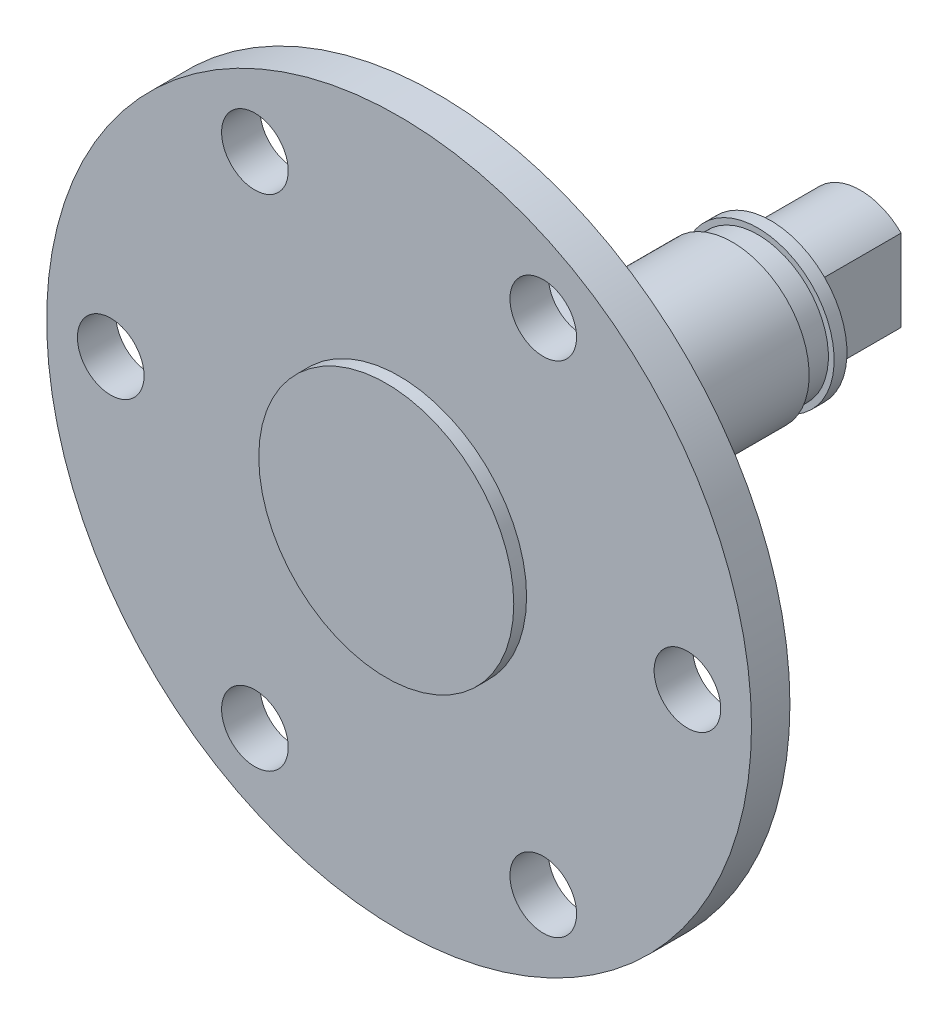
ISO-10303-21;
HEADER;
FILE_DESCRIPTION(('STEP AP214'),'2;1');
FILE_NAME('part.step','',(''),(''),'','','');
FILE_SCHEMA(('AUTOMOTIVE_DESIGN { 1 0 10303 214 1 1 1 1 }'));
ENDSEC;
DATA;
#1=APPLICATION_CONTEXT('core data for automotive mechanical design processes');
#2=APPLICATION_PROTOCOL_DEFINITION('international standard','automotive_design',2000,#1);
#3=PRODUCT_CONTEXT('',#1,'mechanical');
#4=PRODUCT('Part','Part','',(#3));
#5=PRODUCT_RELATED_PRODUCT_CATEGORY('part','',(#4));
#6=PRODUCT_DEFINITION_FORMATION('','',#4);
#7=PRODUCT_DEFINITION_CONTEXT('part definition',#1,'design');
#8=PRODUCT_DEFINITION('design','',#6,#7);
#9=PRODUCT_DEFINITION_SHAPE('','',#8);
#10=(LENGTH_UNIT() NAMED_UNIT(*) SI_UNIT(.MILLI.,.METRE.));
#11=(NAMED_UNIT(*) PLANE_ANGLE_UNIT() SI_UNIT($,.RADIAN.));
#12=(NAMED_UNIT(*) SI_UNIT($,.STERADIAN.) SOLID_ANGLE_UNIT());
#13=UNCERTAINTY_MEASURE_WITH_UNIT(LENGTH_MEASURE(1.E-05),#10,'distance_accuracy_value','');
#14=(GEOMETRIC_REPRESENTATION_CONTEXT(3) GLOBAL_UNCERTAINTY_ASSIGNED_CONTEXT((#13)) GLOBAL_UNIT_ASSIGNED_CONTEXT((#10,
#11,#12)) REPRESENTATION_CONTEXT('',''));
#15=CARTESIAN_POINT('',(0.,0.,0.));
#16=DIRECTION('',(0.,0.,1.));
#17=DIRECTION('',(1.,0.,0.));
#18=AXIS2_PLACEMENT_3D('',#15,#16,#17);
#19=CARTESIAN_POINT('',(0.,0.,-26.));
#20=DIRECTION('',(0.,0.,-1.));
#21=DIRECTION('',(-1.,0.,0.));
#22=AXIS2_PLACEMENT_3D('',#19,#20,#21);
#23=PLANE('',#22);
#24=CARTESIAN_POINT('',(0.,0.,-26.));
#25=DIRECTION('',(0.,0.,-1.));
#26=DIRECTION('',(-1.,0.,0.));
#27=AXIS2_PLACEMENT_3D('',#24,#25,#26);
#28=CIRCLE('',#27,5.95);
#29=CARTESIAN_POINT('',(-5.95,0.,-26.));
#30=VERTEX_POINT('',#29);
#31=EDGE_CURVE('E115',#30,#30,#28,.T.);
#32=ORIENTED_EDGE('',*,*,#31,.T.);
#33=EDGE_LOOP('',(#32));
#34=FACE_BOUND('',#33,.T.);
#35=DIRECTION('',(0.,1.,0.));
#36=VECTOR('',#35,1.);
#37=CARTESIAN_POINT('',(3.175,0.,-26.));
#38=LINE('',#37,#36);
#39=CARTESIAN_POINT('',(3.175,-3.1889457505577,-26.));
#40=VERTEX_POINT('',#39);
#41=CARTESIAN_POINT('',(3.175,3.1889457505577,-26.));
#42=VERTEX_POINT('',#41);
#43=EDGE_CURVE('E103',#40,#42,#38,.T.);
#44=ORIENTED_EDGE('',*,*,#43,.T.);
#45=CARTESIAN_POINT('',(0.,0.,-26.));
#46=DIRECTION('',(0.,0.,-1.));
#47=DIRECTION('',(-1.,0.,0.));
#48=AXIS2_PLACEMENT_3D('',#45,#46,#47);
#49=CIRCLE('',#48,4.5);
#50=CARTESIAN_POINT('',(-3.175,3.1889457505577,-26.));
#51=VERTEX_POINT('',#50);
#52=EDGE_CURVE('E109',#51,#42,#49,.T.);
#53=ORIENTED_EDGE('',*,*,#52,.F.);
#54=DIRECTION('',(0.,1.,0.));
#55=VECTOR('',#54,1.);
#56=CARTESIAN_POINT('',(-3.175,0.,-26.));
#57=LINE('',#56,#55);
#58=CARTESIAN_POINT('',(-3.175,-3.1889457505577,-26.));
#59=VERTEX_POINT('',#58);
#60=EDGE_CURVE('E107',#59,#51,#57,.T.);
#61=ORIENTED_EDGE('',*,*,#60,.F.);
#62=CARTESIAN_POINT('',(0.,0.,-26.));
#63=DIRECTION('',(0.,0.,-1.));
#64=DIRECTION('',(-1.,0.,0.));
#65=AXIS2_PLACEMENT_3D('',#62,#63,#64);
#66=CIRCLE('',#65,4.5);
#67=EDGE_CURVE('E94',#40,#59,#66,.T.);
#68=ORIENTED_EDGE('',*,*,#67,.F.);
#69=EDGE_LOOP('',(#44,#53,#61,#68));
#70=FACE_BOUND('',#69,.T.);
#71=ADVANCED_FACE('F36',(#34,#70),#23,.T.);
#72=CARTESIAN_POINT('',(0.,0.,3.));
#73=DIRECTION('',(0.,0.,-1.));
#74=DIRECTION('',(-1.,0.,0.));
#75=AXIS2_PLACEMENT_3D('',#72,#73,#74);
#76=CYLINDRICAL_SURFACE('',#75,27.5);
#77=CARTESIAN_POINT('',(0.,0.,3.));
#78=DIRECTION('',(0.,0.,1.));
#79=DIRECTION('',(1.,0.,0.));
#80=AXIS2_PLACEMENT_3D('',#77,#78,#79);
#81=CIRCLE('',#80,27.5);
#82=CARTESIAN_POINT('',(27.5,0.,3.));
#83=VERTEX_POINT('',#82);
#84=EDGE_CURVE('E162',#83,#83,#81,.T.);
#85=ORIENTED_EDGE('',*,*,#84,.F.);
#86=EDGE_LOOP('',(#85));
#87=FACE_BOUND('',#86,.T.);
#88=CARTESIAN_POINT('',(0.,0.,0.));
#89=DIRECTION('',(0.,0.,1.));
#90=DIRECTION('',(1.,0.,0.));
#91=AXIS2_PLACEMENT_3D('',#88,#89,#90);
#92=CIRCLE('',#91,27.5);
#93=CARTESIAN_POINT('',(27.5,0.,0.));
#94=VERTEX_POINT('',#93);
#95=EDGE_CURVE('E165',#94,#94,#92,.T.);
#96=ORIENTED_EDGE('',*,*,#95,.T.);
#97=EDGE_LOOP('',(#96));
#98=FACE_BOUND('',#97,.T.);
#99=ADVANCED_FACE('F202',(#87,#98),#76,.T.);
#100=CARTESIAN_POINT('',(0.,0.,3.));
#101=DIRECTION('',(0.,0.,1.));
#102=DIRECTION('',(1.,0.,0.));
#103=AXIS2_PLACEMENT_3D('',#100,#101,#102);
#104=PLANE('',#103);
#105=CARTESIAN_POINT('',(0.,0.,3.));
#106=DIRECTION('',(0.,0.,1.));
#107=DIRECTION('',(1.,0.,0.));
#108=AXIS2_PLACEMENT_3D('',#105,#106,#107);
#109=CIRCLE('',#108,9.95);
#110=CARTESIAN_POINT('',(9.95,0.,3.));
#111=VERTEX_POINT('',#110);
#112=EDGE_CURVE('E135',#111,#111,#109,.T.);
#113=ORIENTED_EDGE('',*,*,#112,.F.);
#114=EDGE_LOOP('',(#113));
#115=FACE_BOUND('',#114,.T.);
#116=CARTESIAN_POINT('',(11.25,-19.4855715851499,3.));
#117=DIRECTION('',(0.,0.,1.));
#118=DIRECTION('',(1.,0.,0.));
#119=AXIS2_PLACEMENT_3D('',#116,#117,#118);
#120=CIRCLE('',#119,2.6);
#121=CARTESIAN_POINT('',(13.85,-19.4855715851499,3.));
#122=VERTEX_POINT('',#121);
#123=EDGE_CURVE('E142',#122,#122,#120,.T.);
#124=ORIENTED_EDGE('',*,*,#123,.F.);
#125=EDGE_LOOP('',(#124));
#126=FACE_BOUND('',#125,.T.);
#127=CARTESIAN_POINT('',(-11.25,-19.4855715851499,3.));
#128=DIRECTION('',(0.,0.,1.));
#129=DIRECTION('',(1.,0.,0.));
#130=AXIS2_PLACEMENT_3D('',#127,#128,#129);
#131=CIRCLE('',#130,2.6);
#132=CARTESIAN_POINT('',(-8.65,-19.4855715851499,3.));
#133=VERTEX_POINT('',#132);
#134=EDGE_CURVE('E146',#133,#133,#131,.T.);
#135=ORIENTED_EDGE('',*,*,#134,.F.);
#136=EDGE_LOOP('',(#135));
#137=FACE_BOUND('',#136,.T.);
#138=CARTESIAN_POINT('',(-22.5,0.,3.));
#139=DIRECTION('',(0.,0.,1.));
#140=DIRECTION('',(1.,0.,0.));
#141=AXIS2_PLACEMENT_3D('',#138,#139,#140);
#142=CIRCLE('',#141,2.6);
#143=CARTESIAN_POINT('',(-19.9,0.,3.));
#144=VERTEX_POINT('',#143);
#145=EDGE_CURVE('E149',#144,#144,#142,.T.);
#146=ORIENTED_EDGE('',*,*,#145,.F.);
#147=EDGE_LOOP('',(#146));
#148=FACE_BOUND('',#147,.T.);
#149=CARTESIAN_POINT('',(-11.25,19.4855715851499,3.));
#150=DIRECTION('',(0.,0.,1.));
#151=DIRECTION('',(1.,0.,0.));
#152=AXIS2_PLACEMENT_3D('',#149,#150,#151);
#153=CIRCLE('',#152,2.6);
#154=CARTESIAN_POINT('',(-8.65000000000001,19.4855715851499,3.));
#155=VERTEX_POINT('',#154);
#156=EDGE_CURVE('E152',#155,#155,#153,.T.);
#157=ORIENTED_EDGE('',*,*,#156,.F.);
#158=EDGE_LOOP('',(#157));
#159=FACE_BOUND('',#158,.T.);
#160=CARTESIAN_POINT('',(11.25,19.4855715851499,3.));
#161=DIRECTION('',(0.,0.,1.));
#162=DIRECTION('',(1.,0.,0.));
#163=AXIS2_PLACEMENT_3D('',#160,#161,#162);
#164=CIRCLE('',#163,2.6);
#165=CARTESIAN_POINT('',(13.85,19.4855715851499,3.));
#166=VERTEX_POINT('',#165);
#167=EDGE_CURVE('E139',#166,#166,#164,.T.);
#168=ORIENTED_EDGE('',*,*,#167,.F.);
#169=EDGE_LOOP('',(#168));
#170=FACE_BOUND('',#169,.T.);
#171=CARTESIAN_POINT('',(22.5,0.,3.));
#172=DIRECTION('',(0.,0.,1.));
#173=DIRECTION('',(1.,0.,0.));
#174=AXIS2_PLACEMENT_3D('',#171,#172,#173);
#175=CIRCLE('',#174,2.59999999999999);
#176=CARTESIAN_POINT('',(25.1,0.,3.));
#177=VERTEX_POINT('',#176);
#178=EDGE_CURVE('E157',#177,#177,#175,.T.);
#179=ORIENTED_EDGE('',*,*,#178,.F.);
#180=EDGE_LOOP('',(#179));
#181=FACE_BOUND('',#180,.T.);
#182=ORIENTED_EDGE('',*,*,#84,.T.);
#183=EDGE_LOOP('',(#182));
#184=FACE_BOUND('',#183,.T.);
#185=ADVANCED_FACE('F208',(#115,#126,#137,#148,#159,#170,#181,#184),#104,.T.);
#186=CARTESIAN_POINT('',(0.,0.,0.));
#187=DIRECTION('',(0.,0.,1.));
#188=DIRECTION('',(1.,0.,0.));
#189=AXIS2_PLACEMENT_3D('',#186,#187,#188);
#190=PLANE('',#189);
#191=CARTESIAN_POINT('',(0.,0.,0.));
#192=DIRECTION('',(0.,0.,1.));
#193=DIRECTION('',(1.,0.,0.));
#194=AXIS2_PLACEMENT_3D('',#191,#192,#193);
#195=CIRCLE('',#194,13.);
#196=CARTESIAN_POINT('',(13.,0.,0.));
#197=VERTEX_POINT('',#196);
#198=EDGE_CURVE('E11',#197,#197,#195,.T.);
#199=ORIENTED_EDGE('',*,*,#198,.T.);
#200=EDGE_LOOP('',(#199));
#201=FACE_BOUND('',#200,.T.);
#202=CARTESIAN_POINT('',(11.25,-19.4855715851499,0.));
#203=DIRECTION('',(0.,0.,1.));
#204=DIRECTION('',(1.,0.,0.));
#205=AXIS2_PLACEMENT_3D('',#202,#203,#204);
#206=CIRCLE('',#205,2.6);
#207=CARTESIAN_POINT('',(13.85,-19.4855715851499,0.));
#208=VERTEX_POINT('',#207);
#209=EDGE_CURVE('E161',#208,#208,#206,.T.);
#210=ORIENTED_EDGE('',*,*,#209,.T.);
#211=EDGE_LOOP('',(#210));
#212=FACE_BOUND('',#211,.T.);
#213=CARTESIAN_POINT('',(-11.25,-19.4855715851499,0.));
#214=DIRECTION('',(0.,0.,1.));
#215=DIRECTION('',(1.,0.,0.));
#216=AXIS2_PLACEMENT_3D('',#213,#214,#215);
#217=CIRCLE('',#216,2.6);
#218=CARTESIAN_POINT('',(-8.65,-19.4855715851499,0.));
#219=VERTEX_POINT('',#218);
#220=EDGE_CURVE('E178',#219,#219,#217,.T.);
#221=ORIENTED_EDGE('',*,*,#220,.T.);
#222=EDGE_LOOP('',(#221));
#223=FACE_BOUND('',#222,.T.);
#224=CARTESIAN_POINT('',(-22.5,0.,0.));
#225=DIRECTION('',(0.,0.,1.));
#226=DIRECTION('',(1.,0.,0.));
#227=AXIS2_PLACEMENT_3D('',#224,#225,#226);
#228=CIRCLE('',#227,2.6);
#229=CARTESIAN_POINT('',(-19.9,0.,0.));
#230=VERTEX_POINT('',#229);
#231=EDGE_CURVE('E175',#230,#230,#228,.T.);
#232=ORIENTED_EDGE('',*,*,#231,.T.);
#233=EDGE_LOOP('',(#232));
#234=FACE_BOUND('',#233,.T.);
#235=CARTESIAN_POINT('',(-11.25,19.4855715851499,0.));
#236=DIRECTION('',(0.,0.,1.));
#237=DIRECTION('',(1.,0.,0.));
#238=AXIS2_PLACEMENT_3D('',#235,#236,#237);
#239=CIRCLE('',#238,2.6);
#240=CARTESIAN_POINT('',(-8.65000000000001,19.4855715851499,0.));
#241=VERTEX_POINT('',#240);
#242=EDGE_CURVE('E172',#241,#241,#239,.T.);
#243=ORIENTED_EDGE('',*,*,#242,.T.);
#244=EDGE_LOOP('',(#243));
#245=FACE_BOUND('',#244,.T.);
#246=CARTESIAN_POINT('',(11.25,19.4855715851499,0.));
#247=DIRECTION('',(0.,0.,1.));
#248=DIRECTION('',(1.,0.,0.));
#249=AXIS2_PLACEMENT_3D('',#246,#247,#248);
#250=CIRCLE('',#249,2.6);
#251=CARTESIAN_POINT('',(13.85,19.4855715851499,0.));
#252=VERTEX_POINT('',#251);
#253=EDGE_CURVE('E145',#252,#252,#250,.T.);
#254=ORIENTED_EDGE('',*,*,#253,.T.);
#255=EDGE_LOOP('',(#254));
#256=FACE_BOUND('',#255,.T.);
#257=CARTESIAN_POINT('',(22.5,0.,0.));
#258=DIRECTION('',(0.,0.,1.));
#259=DIRECTION('',(1.,0.,0.));
#260=AXIS2_PLACEMENT_3D('',#257,#258,#259);
#261=CIRCLE('',#260,2.59999999999999);
#262=CARTESIAN_POINT('',(25.1,0.,0.));
#263=VERTEX_POINT('',#262);
#264=EDGE_CURVE('E160',#263,#263,#261,.T.);
#265=ORIENTED_EDGE('',*,*,#264,.T.);
#266=EDGE_LOOP('',(#265));
#267=FACE_BOUND('',#266,.T.);
#268=ORIENTED_EDGE('',*,*,#95,.F.);
#269=EDGE_LOOP('',(#268));
#270=FACE_BOUND('',#269,.T.);
#271=ADVANCED_FACE('F265',(#201,#212,#223,#234,#245,#256,#267,#270),#190,.F.);
#272=CARTESIAN_POINT('',(22.5,0.,-2.));
#273=DIRECTION('',(0.,0.,1.));
#274=DIRECTION('',(1.,0.,0.));
#275=AXIS2_PLACEMENT_3D('',#272,#273,#274);
#276=CYLINDRICAL_SURFACE('',#275,2.59999999999999);
#277=ORIENTED_EDGE('',*,*,#178,.T.);
#278=EDGE_LOOP('',(#277));
#279=FACE_BOUND('',#278,.T.);
#280=ORIENTED_EDGE('',*,*,#264,.F.);
#281=EDGE_LOOP('',(#280));
#282=FACE_BOUND('',#281,.T.);
#283=ADVANCED_FACE('F261',(#279,#282),#276,.F.);
#284=CARTESIAN_POINT('',(11.25,19.4855715851499,-2.));
#285=DIRECTION('',(0.,0.,1.));
#286=DIRECTION('',(1.,0.,0.));
#287=AXIS2_PLACEMENT_3D('',#284,#285,#286);
#288=CYLINDRICAL_SURFACE('',#287,2.6);
#289=ORIENTED_EDGE('',*,*,#167,.T.);
#290=EDGE_LOOP('',(#289));
#291=FACE_BOUND('',#290,.T.);
#292=ORIENTED_EDGE('',*,*,#253,.F.);
#293=EDGE_LOOP('',(#292));
#294=FACE_BOUND('',#293,.T.);
#295=ADVANCED_FACE('F257',(#291,#294),#288,.F.);
#296=CARTESIAN_POINT('',(-11.25,19.4855715851499,-2.));
#297=DIRECTION('',(0.,0.,1.));
#298=DIRECTION('',(1.,0.,0.));
#299=AXIS2_PLACEMENT_3D('',#296,#297,#298);
#300=CYLINDRICAL_SURFACE('',#299,2.6);
#301=ORIENTED_EDGE('',*,*,#156,.T.);
#302=EDGE_LOOP('',(#301));
#303=FACE_BOUND('',#302,.T.);
#304=ORIENTED_EDGE('',*,*,#242,.F.);
#305=EDGE_LOOP('',(#304));
#306=FACE_BOUND('',#305,.T.);
#307=ADVANCED_FACE('F253',(#303,#306),#300,.F.);
#308=CARTESIAN_POINT('',(-22.5,0.,-2.));
#309=DIRECTION('',(0.,0.,1.));
#310=DIRECTION('',(1.,0.,0.));
#311=AXIS2_PLACEMENT_3D('',#308,#309,#310);
#312=CYLINDRICAL_SURFACE('',#311,2.6);
#313=ORIENTED_EDGE('',*,*,#145,.T.);
#314=EDGE_LOOP('',(#313));
#315=FACE_BOUND('',#314,.T.);
#316=ORIENTED_EDGE('',*,*,#231,.F.);
#317=EDGE_LOOP('',(#316));
#318=FACE_BOUND('',#317,.T.);
#319=ADVANCED_FACE('F249',(#315,#318),#312,.F.);
#320=CARTESIAN_POINT('',(-11.25,-19.4855715851499,-2.));
#321=DIRECTION('',(0.,0.,1.));
#322=DIRECTION('',(1.,0.,0.));
#323=AXIS2_PLACEMENT_3D('',#320,#321,#322);
#324=CYLINDRICAL_SURFACE('',#323,2.6);
#325=ORIENTED_EDGE('',*,*,#134,.T.);
#326=EDGE_LOOP('',(#325));
#327=FACE_BOUND('',#326,.T.);
#328=ORIENTED_EDGE('',*,*,#220,.F.);
#329=EDGE_LOOP('',(#328));
#330=FACE_BOUND('',#329,.T.);
#331=ADVANCED_FACE('F245',(#327,#330),#324,.F.);
#332=CARTESIAN_POINT('',(11.25,-19.4855715851499,-2.));
#333=DIRECTION('',(0.,0.,1.));
#334=DIRECTION('',(1.,0.,0.));
#335=AXIS2_PLACEMENT_3D('',#332,#333,#334);
#336=CYLINDRICAL_SURFACE('',#335,2.6);
#337=ORIENTED_EDGE('',*,*,#123,.T.);
#338=EDGE_LOOP('',(#337));
#339=FACE_BOUND('',#338,.T.);
#340=ORIENTED_EDGE('',*,*,#209,.F.);
#341=EDGE_LOOP('',(#340));
#342=FACE_BOUND('',#341,.T.);
#343=ADVANCED_FACE('F241',(#339,#342),#336,.F.);
#344=CARTESIAN_POINT('',(0.,0.,4.));
#345=DIRECTION('',(0.,0.,-1.));
#346=DIRECTION('',(-1.,0.,0.));
#347=AXIS2_PLACEMENT_3D('',#344,#345,#346);
#348=CYLINDRICAL_SURFACE('',#347,9.95);
#349=CARTESIAN_POINT('',(0.,0.,4.));
#350=DIRECTION('',(0.,0.,1.));
#351=DIRECTION('',(1.,0.,0.));
#352=AXIS2_PLACEMENT_3D('',#349,#350,#351);
#353=CIRCLE('',#352,9.95);
#354=CARTESIAN_POINT('',(9.95,0.,4.));
#355=VERTEX_POINT('',#354);
#356=EDGE_CURVE('E136',#355,#355,#353,.T.);
#357=ORIENTED_EDGE('',*,*,#356,.F.);
#358=EDGE_LOOP('',(#357));
#359=FACE_BOUND('',#358,.T.);
#360=ORIENTED_EDGE('',*,*,#112,.T.);
#361=EDGE_LOOP('',(#360));
#362=FACE_BOUND('',#361,.T.);
#363=ADVANCED_FACE('F237',(#359,#362),#348,.T.);
#364=CARTESIAN_POINT('',(0.,0.,4.));
#365=DIRECTION('',(0.,0.,1.));
#366=DIRECTION('',(1.,0.,0.));
#367=AXIS2_PLACEMENT_3D('',#364,#365,#366);
#368=PLANE('',#367);
#369=ORIENTED_EDGE('',*,*,#356,.T.);
#370=EDGE_LOOP('',(#369));
#371=FACE_BOUND('',#370,.T.);
#372=ADVANCED_FACE('F234',(#371),#368,.T.);
#373=CARTESIAN_POINT('',(0.,0.,-13.));
#374=DIRECTION('',(0.,0.,1.));
#375=DIRECTION('',(1.,0.,0.));
#376=AXIS2_PLACEMENT_3D('',#373,#374,#375);
#377=CYLINDRICAL_SURFACE('',#376,8.);
#378=CARTESIAN_POINT('',(0.,0.,-5.));
#379=DIRECTION('',(0.,0.,1.));
#380=DIRECTION('',(1.,0.,0.));
#381=AXIS2_PLACEMENT_3D('',#378,#379,#380);
#382=CIRCLE('',#381,8.);
#383=CARTESIAN_POINT('',(8.,0.,-5.));
#384=VERTEX_POINT('',#383);
#385=EDGE_CURVE('E44',#384,#384,#382,.F.);
#386=CARTESIAN_POINT('',(0.,0.,-13.));
#387=DIRECTION('',(0.,0.,-1.));
#388=DIRECTION('',(-1.,0.,0.));
#389=AXIS2_PLACEMENT_3D('',#386,#387,#388);
#390=CIRCLE('',#389,8.);
#391=CARTESIAN_POINT('',(8.,0.,-13.));
#392=VERTEX_POINT('',#391);
#393=EDGE_CURVE('E130',#392,#392,#390,.T.);
#394=CARTESIAN_POINT('',(8.,0.,-5.));
#395=CARTESIAN_POINT('',(8.,0.,-5.08333333333333));
#396=CARTESIAN_POINT('',(8.,0.,-5.16666666666667));
#397=CARTESIAN_POINT('',(8.,0.,-5.33333333333333));
#398=CARTESIAN_POINT('',(8.,0.,-5.41666666666667));
#399=CARTESIAN_POINT('',(8.,0.,-5.58333333333333));
#400=CARTESIAN_POINT('',(8.,0.,-5.66666666666667));
#401=CARTESIAN_POINT('',(8.,0.,-5.83333333333333));
#402=CARTESIAN_POINT('',(8.,0.,-5.91666666666667));
#403=CARTESIAN_POINT('',(8.,0.,-6.08333333333333));
#404=CARTESIAN_POINT('',(8.,0.,-6.16666666666667));
#405=CARTESIAN_POINT('',(8.,0.,-6.33333333333333));
#406=CARTESIAN_POINT('',(8.,0.,-6.41666666666667));
#407=CARTESIAN_POINT('',(8.,0.,-6.58333333333333));
#408=CARTESIAN_POINT('',(8.,0.,-6.66666666666667));
#409=CARTESIAN_POINT('',(8.,0.,-6.83333333333333));
#410=CARTESIAN_POINT('',(8.,0.,-6.91666666666667));
#411=CARTESIAN_POINT('',(8.,0.,-7.08333333333333));
#412=CARTESIAN_POINT('',(8.,0.,-7.16666666666667));
#413=CARTESIAN_POINT('',(8.,0.,-7.33333333333333));
#414=CARTESIAN_POINT('',(8.,0.,-7.41666666666667));
#415=CARTESIAN_POINT('',(8.,0.,-7.58333333333333));
#416=CARTESIAN_POINT('',(8.,0.,-7.66666666666667));
#417=CARTESIAN_POINT('',(8.,0.,-7.83333333333333));
#418=CARTESIAN_POINT('',(8.,0.,-7.91666666666667));
#419=CARTESIAN_POINT('',(8.,0.,-8.08333333333333));
#420=CARTESIAN_POINT('',(8.,0.,-8.16666666666667));
#421=CARTESIAN_POINT('',(8.,0.,-8.33333333333333));
#422=CARTESIAN_POINT('',(8.,0.,-8.41666666666667));
#423=CARTESIAN_POINT('',(8.,0.,-8.58333333333333));
#424=CARTESIAN_POINT('',(8.,0.,-8.66666666666667));
#425=CARTESIAN_POINT('',(8.,0.,-8.83333333333333));
#426=CARTESIAN_POINT('',(8.,0.,-8.91666666666667));
#427=CARTESIAN_POINT('',(8.,0.,-9.08333333333333));
#428=CARTESIAN_POINT('',(8.,0.,-9.16666666666667));
#429=CARTESIAN_POINT('',(8.,0.,-9.33333333333333));
#430=CARTESIAN_POINT('',(8.,0.,-9.41666666666667));
#431=CARTESIAN_POINT('',(8.,0.,-9.58333333333333));
#432=CARTESIAN_POINT('',(8.,0.,-9.66666666666667));
#433=CARTESIAN_POINT('',(8.,0.,-9.83333333333333));
#434=CARTESIAN_POINT('',(8.,0.,-9.91666666666667));
#435=CARTESIAN_POINT('',(8.,0.,-10.0833333333333));
#436=CARTESIAN_POINT('',(8.,0.,-10.1666666666667));
#437=CARTESIAN_POINT('',(8.,0.,-10.3333333333333));
#438=CARTESIAN_POINT('',(8.,0.,-10.4166666666667));
#439=CARTESIAN_POINT('',(8.,0.,-10.5833333333333));
#440=CARTESIAN_POINT('',(8.,0.,-10.6666666666667));
#441=CARTESIAN_POINT('',(8.,0.,-10.8333333333333));
#442=CARTESIAN_POINT('',(8.,0.,-10.9166666666667));
#443=CARTESIAN_POINT('',(8.,0.,-11.0833333333333));
#444=CARTESIAN_POINT('',(8.,0.,-11.1666666666667));
#445=CARTESIAN_POINT('',(8.,0.,-11.3333333333333));
#446=CARTESIAN_POINT('',(8.,0.,-11.4166666666667));
#447=CARTESIAN_POINT('',(8.,0.,-11.5833333333333));
#448=CARTESIAN_POINT('',(8.,0.,-11.6666666666667));
#449=CARTESIAN_POINT('',(8.,0.,-11.8333333333333));
#450=CARTESIAN_POINT('',(8.,0.,-11.9166666666667));
#451=CARTESIAN_POINT('',(8.,0.,-12.0833333333333));
#452=CARTESIAN_POINT('',(8.,0.,-12.1666666666667));
#453=CARTESIAN_POINT('',(8.,0.,-12.3333333333333));
#454=CARTESIAN_POINT('',(8.,0.,-12.4166666666667));
#455=CARTESIAN_POINT('',(8.,0.,-12.5833333333333));
#456=CARTESIAN_POINT('',(8.,0.,-12.6666666666667));
#457=CARTESIAN_POINT('',(8.,0.,-12.8333333333333));
#458=CARTESIAN_POINT('',(8.,0.,-12.9166666666667));
#459=CARTESIAN_POINT('',(8.,0.,-13.));
#460=B_SPLINE_CURVE_WITH_KNOTS('',3,(#394,#395,#396,#397,#398,#399,#400,#401,#402,#403,#404,
#405,#406,#407,#408,#409,#410,#411,#412,#413,#414,#415,#416,#417,#418,#419,#420,#421,#422,#423,
#424,#425,#426,#427,#428,#429,#430,#431,#432,#433,#434,#435,#436,#437,#438,#439,#440,#441,#442,
#443,#444,#445,#446,#447,#448,#449,#450,#451,#452,#453,#454,#455,#456,#457,#458,#459),
.UNSPECIFIED.,.F.,.F.,(4,2,2,2,2,2,2,2,2,2,2,2,2,2,2,2,2,2,2,2,2,2,2,2,2,2,2,2,2,2,2,2,4),(0.,
0.249999999999999,0.5,0.749999999999999,0.999999999999999,1.25,1.5,1.75,2.,2.25,2.5,2.75,3.,
3.25,3.5,3.75,4.,4.25,4.5,4.75,5.,5.25,5.5,5.75,6.,6.25,6.5,6.75,7.,7.25,7.5,7.75,8.),.UNSPECIFIED.);
#461=EDGE_CURVE('BSEAM185',#384,#392,#460,.T.);
#462=ORIENTED_EDGE('',*,*,#385,.T.);
#463=ORIENTED_EDGE('',*,*,#393,.F.);
#464=ORIENTED_EDGE('',*,*,#461,.T.);
#465=ORIENTED_EDGE('',*,*,#461,.F.);
#466=EDGE_LOOP('',(#462,#464,#463,#465));
#467=FACE_BOUND('',#466,.T.);
#468=ADVANCED_FACE('F185',(#467),#377,.T.);
#469=CARTESIAN_POINT('',(0.,0.,-13.));
#470=DIRECTION('',(0.,0.,-1.));
#471=DIRECTION('',(-1.,0.,0.));
#472=AXIS2_PLACEMENT_3D('',#469,#470,#471);
#473=PLANE('',#472);
#474=CARTESIAN_POINT('',(0.,0.,-13.));
#475=DIRECTION('',(0.,0.,-1.));
#476=DIRECTION('',(-1.,0.,0.));
#477=AXIS2_PLACEMENT_3D('',#474,#475,#476);
#478=CIRCLE('',#477,6.);
#479=CARTESIAN_POINT('',(-6.,0.,-13.));
#480=VERTEX_POINT('',#479);
#481=EDGE_CURVE('E124',#480,#480,#478,.T.);
#482=ORIENTED_EDGE('',*,*,#481,.F.);
#483=EDGE_LOOP('',(#482));
#484=FACE_BOUND('',#483,.T.);
#485=ORIENTED_EDGE('',*,*,#393,.T.);
#486=EDGE_LOOP('',(#485));
#487=FACE_BOUND('',#486,.T.);
#488=ADVANCED_FACE('F227',(#484,#487),#473,.T.);
#489=CARTESIAN_POINT('',(0.,0.,-23.));
#490=DIRECTION('',(0.,0.,1.));
#491=DIRECTION('',(1.,0.,0.));
#492=AXIS2_PLACEMENT_3D('',#489,#490,#491);
#493=CYLINDRICAL_SURFACE('',#492,6.);
#494=CARTESIAN_POINT('',(0.,0.,-23.));
#495=DIRECTION('',(0.,0.,-1.));
#496=DIRECTION('',(-1.,0.,0.));
#497=AXIS2_PLACEMENT_3D('',#494,#495,#496);
#498=CIRCLE('',#497,6.);
#499=CARTESIAN_POINT('',(-6.,0.,-23.));
#500=VERTEX_POINT('',#499);
#501=EDGE_CURVE('E127',#500,#500,#498,.T.);
#502=ORIENTED_EDGE('',*,*,#501,.F.);
#503=EDGE_LOOP('',(#502));
#504=FACE_BOUND('',#503,.T.);
#505=ORIENTED_EDGE('',*,*,#481,.T.);
#506=EDGE_LOOP('',(#505));
#507=FACE_BOUND('',#506,.T.);
#508=ADVANCED_FACE('F223',(#504,#507),#493,.T.);
#509=CARTESIAN_POINT('',(0.,0.,-23.));
#510=DIRECTION('',(0.,0.,-1.));
#511=DIRECTION('',(-1.,0.,0.));
#512=AXIS2_PLACEMENT_3D('',#509,#510,#511);
#513=PLANE('',#512);
#514=CARTESIAN_POINT('',(0.,0.,-23.));
#515=DIRECTION('',(0.,0.,-1.));
#516=DIRECTION('',(-1.,0.,0.));
#517=AXIS2_PLACEMENT_3D('',#514,#515,#516);
#518=CIRCLE('',#517,5.5);
#519=CARTESIAN_POINT('',(-5.5,0.,-23.));
#520=VERTEX_POINT('',#519);
#521=EDGE_CURVE('E118',#520,#520,#518,.T.);
#522=ORIENTED_EDGE('',*,*,#521,.F.);
#523=EDGE_LOOP('',(#522));
#524=FACE_BOUND('',#523,.T.);
#525=ORIENTED_EDGE('',*,*,#501,.T.);
#526=EDGE_LOOP('',(#525));
#527=FACE_BOUND('',#526,.T.);
#528=ADVANCED_FACE('F219',(#524,#527),#513,.T.);
#529=CARTESIAN_POINT('',(0.,0.,-25.));
#530=DIRECTION('',(0.,0.,1.));
#531=DIRECTION('',(1.,0.,0.));
#532=AXIS2_PLACEMENT_3D('',#529,#530,#531);
#533=CYLINDRICAL_SURFACE('',#532,5.5);
#534=CARTESIAN_POINT('',(0.,0.,-25.));
#535=DIRECTION('',(0.,0.,-1.));
#536=DIRECTION('',(-1.,0.,0.));
#537=AXIS2_PLACEMENT_3D('',#534,#535,#536);
#538=CIRCLE('',#537,5.5);
#539=CARTESIAN_POINT('',(-5.5,0.,-25.));
#540=VERTEX_POINT('',#539);
#541=EDGE_CURVE('E121',#540,#540,#538,.T.);
#542=ORIENTED_EDGE('',*,*,#541,.F.);
#543=EDGE_LOOP('',(#542));
#544=FACE_BOUND('',#543,.T.);
#545=ORIENTED_EDGE('',*,*,#521,.T.);
#546=EDGE_LOOP('',(#545));
#547=FACE_BOUND('',#546,.T.);
#548=ADVANCED_FACE('F215',(#544,#547),#533,.T.);
#549=CARTESIAN_POINT('',(0.,0.,-26.));
#550=DIRECTION('',(0.,0.,1.));
#551=DIRECTION('',(1.,0.,0.));
#552=AXIS2_PLACEMENT_3D('',#549,#550,#551);
#553=CYLINDRICAL_SURFACE('',#552,5.95);
#554=ORIENTED_EDGE('',*,*,#31,.F.);
#555=EDGE_LOOP('',(#554));
#556=FACE_BOUND('',#555,.T.);
#557=CARTESIAN_POINT('',(0.,0.,-25.));
#558=DIRECTION('',(0.,0.,-1.));
#559=DIRECTION('',(-1.,0.,0.));
#560=AXIS2_PLACEMENT_3D('',#557,#558,#559);
#561=CIRCLE('',#560,5.95);
#562=CARTESIAN_POINT('',(-5.95,0.,-25.));
#563=VERTEX_POINT('',#562);
#564=EDGE_CURVE('E114',#563,#563,#561,.T.);
#565=ORIENTED_EDGE('',*,*,#564,.T.);
#566=EDGE_LOOP('',(#565));
#567=FACE_BOUND('',#566,.T.);
#568=ADVANCED_FACE('F197',(#556,#567),#553,.T.);
#569=CARTESIAN_POINT('',(0.,0.,-25.));
#570=DIRECTION('',(0.,0.,-1.));
#571=DIRECTION('',(-1.,0.,0.));
#572=AXIS2_PLACEMENT_3D('',#569,#570,#571);
#573=PLANE('',#572);
#574=ORIENTED_EDGE('',*,*,#541,.T.);
#575=EDGE_LOOP('',(#574));
#576=FACE_BOUND('',#575,.T.);
#577=ORIENTED_EDGE('',*,*,#564,.F.);
#578=EDGE_LOOP('',(#577));
#579=FACE_BOUND('',#578,.T.);
#580=ADVANCED_FACE('F190',(#576,#579),#573,.F.);
#581=CARTESIAN_POINT('',(0.,0.,-5.));
#582=DIRECTION('',(0.,0.,1.));
#583=DIRECTION('',(1.,0.,0.));
#584=AXIS2_PLACEMENT_3D('',#581,#582,#583);
#585=TOROIDAL_SURFACE('',#584,13.,5.);
#586=ORIENTED_EDGE('',*,*,#198,.F.);
#587=EDGE_LOOP('',(#586));
#588=FACE_BOUND('',#587,.T.);
#589=ORIENTED_EDGE('',*,*,#385,.F.);
#590=EDGE_LOOP('',(#589));
#591=FACE_BOUND('',#590,.T.);
#592=ADVANCED_FACE('F38',(#588,#591),#585,.F.);
#593=CARTESIAN_POINT('',(3.175,0.,-33.));
#594=DIRECTION('',(1.,0.,0.));
#595=DIRECTION('',(0.,1.,0.));
#596=AXIS2_PLACEMENT_3D('',#593,#594,#595);
#597=PLANE('',#596);
#598=ORIENTED_EDGE('',*,*,#43,.F.);
#599=DIRECTION('',(0.,0.,1.));
#600=VECTOR('',#599,1.);
#601=CARTESIAN_POINT('',(3.175,-3.1889457505577,-33.));
#602=LINE('',#601,#600);
#603=CARTESIAN_POINT('',(3.175,-3.1889457505577,-33.));
#604=VERTEX_POINT('',#603);
#605=EDGE_CURVE('E79',#604,#40,#602,.T.);
#606=ORIENTED_EDGE('',*,*,#605,.F.);
#607=DIRECTION('',(0.,1.,0.));
#608=VECTOR('',#607,1.);
#609=CARTESIAN_POINT('',(3.175,0.,-33.));
#610=LINE('',#609,#608);
#611=CARTESIAN_POINT('',(3.175,3.1889457505577,-33.));
#612=VERTEX_POINT('',#611);
#613=EDGE_CURVE('E87',#604,#612,#610,.T.);
#614=ORIENTED_EDGE('',*,*,#613,.T.);
#615=DIRECTION('',(0.,0.,1.));
#616=VECTOR('',#615,1.);
#617=CARTESIAN_POINT('',(3.175,3.1889457505577,-33.));
#618=LINE('',#617,#616);
#619=EDGE_CURVE('E76',#612,#42,#618,.T.);
#620=ORIENTED_EDGE('',*,*,#619,.T.);
#621=EDGE_LOOP('',(#598,#606,#614,#620));
#622=FACE_BOUND('',#621,.T.);
#623=ADVANCED_FACE('F189',(#622),#597,.T.);
#624=CARTESIAN_POINT('',(0.,0.,-33.));
#625=DIRECTION('',(0.,0.,1.));
#626=DIRECTION('',(1.,0.,0.));
#627=AXIS2_PLACEMENT_3D('',#624,#625,#626);
#628=CYLINDRICAL_SURFACE('',#627,4.5);
#629=ORIENTED_EDGE('',*,*,#67,.T.);
#630=DIRECTION('',(0.,0.,1.));
#631=VECTOR('',#630,1.);
#632=CARTESIAN_POINT('',(-3.175,-3.1889457505577,-33.));
#633=LINE('',#632,#631);
#634=CARTESIAN_POINT('',(-3.175,-3.1889457505577,-33.));
#635=VERTEX_POINT('',#634);
#636=EDGE_CURVE('E91',#635,#59,#633,.T.);
#637=ORIENTED_EDGE('',*,*,#636,.F.);
#638=CARTESIAN_POINT('',(0.,0.,-33.));
#639=DIRECTION('',(0.,0.,-1.));
#640=DIRECTION('',(-1.,0.,0.));
#641=AXIS2_PLACEMENT_3D('',#638,#639,#640);
#642=CIRCLE('',#641,4.5);
#643=EDGE_CURVE('E82',#604,#635,#642,.T.);
#644=ORIENTED_EDGE('',*,*,#643,.F.);
#645=ORIENTED_EDGE('',*,*,#605,.T.);
#646=EDGE_LOOP('',(#629,#637,#644,#645));
#647=FACE_BOUND('',#646,.T.);
#648=ADVANCED_FACE('F92',(#647),#628,.T.);
#649=CARTESIAN_POINT('',(-3.175,0.,-33.));
#650=DIRECTION('',(1.,0.,0.));
#651=DIRECTION('',(0.,0.,-1.));
#652=AXIS2_PLACEMENT_3D('',#649,#650,#651);
#653=PLANE('',#652);
#654=ORIENTED_EDGE('',*,*,#60,.T.);
#655=DIRECTION('',(0.,0.,1.));
#656=VECTOR('',#655,1.);
#657=CARTESIAN_POINT('',(-3.175,3.1889457505577,-33.));
#658=LINE('',#657,#656);
#659=CARTESIAN_POINT('',(-3.175,3.1889457505577,-33.));
#660=VERTEX_POINT('',#659);
#661=EDGE_CURVE('E51',#660,#51,#658,.T.);
#662=ORIENTED_EDGE('',*,*,#661,.F.);
#663=DIRECTION('',(0.,1.,0.));
#664=VECTOR('',#663,1.);
#665=CARTESIAN_POINT('',(-3.175,0.,-33.));
#666=LINE('',#665,#664);
#667=EDGE_CURVE('E86',#635,#660,#666,.T.);
#668=ORIENTED_EDGE('',*,*,#667,.F.);
#669=ORIENTED_EDGE('',*,*,#636,.T.);
#670=EDGE_LOOP('',(#654,#662,#668,#669));
#671=FACE_BOUND('',#670,.T.);
#672=ADVANCED_FACE('F98',(#671),#653,.F.);
#673=CARTESIAN_POINT('',(0.,0.,-33.));
#674=DIRECTION('',(0.,0.,1.));
#675=DIRECTION('',(1.,0.,0.));
#676=AXIS2_PLACEMENT_3D('',#673,#674,#675);
#677=CYLINDRICAL_SURFACE('',#676,4.5);
#678=ORIENTED_EDGE('',*,*,#52,.T.);
#679=ORIENTED_EDGE('',*,*,#619,.F.);
#680=CARTESIAN_POINT('',(0.,0.,-33.));
#681=DIRECTION('',(0.,0.,-1.));
#682=DIRECTION('',(-1.,0.,0.));
#683=AXIS2_PLACEMENT_3D('',#680,#681,#682);
#684=CIRCLE('',#683,4.5);
#685=EDGE_CURVE('E59',#660,#612,#684,.T.);
#686=ORIENTED_EDGE('',*,*,#685,.F.);
#687=ORIENTED_EDGE('',*,*,#661,.T.);
#688=EDGE_LOOP('',(#678,#679,#686,#687));
#689=FACE_BOUND('',#688,.T.);
#690=ADVANCED_FACE('F389',(#689),#677,.T.);
#691=CARTESIAN_POINT('',(0.,0.,-33.));
#692=DIRECTION('',(0.,0.,-1.));
#693=DIRECTION('',(-1.,0.,0.));
#694=AXIS2_PLACEMENT_3D('',#691,#692,#693);
#695=PLANE('',#694);
#696=ORIENTED_EDGE('',*,*,#613,.F.);
#697=ORIENTED_EDGE('',*,*,#643,.T.);
#698=ORIENTED_EDGE('',*,*,#667,.T.);
#699=ORIENTED_EDGE('',*,*,#685,.T.);
#700=EDGE_LOOP('',(#696,#697,#698,#699));
#701=FACE_BOUND('',#700,.T.);
#702=ADVANCED_FACE('F84',(#701),#695,.T.);
#703=CLOSED_SHELL('',(#71,#99,#185,#271,#283,#295,#307,#319,#331,#343,#363,#372,#468,#488,#508,
#528,#548,#568,#580,#592,#623,#648,#672,#690,#702));
#704=MANIFOLD_SOLID_BREP('B2',#703);
#705=ADVANCED_BREP_SHAPE_REPRESENTATION('',(#18,#704),#14);
#706=SHAPE_DEFINITION_REPRESENTATION(#9,#705);
ENDSEC;
END-ISO-10303-21;
